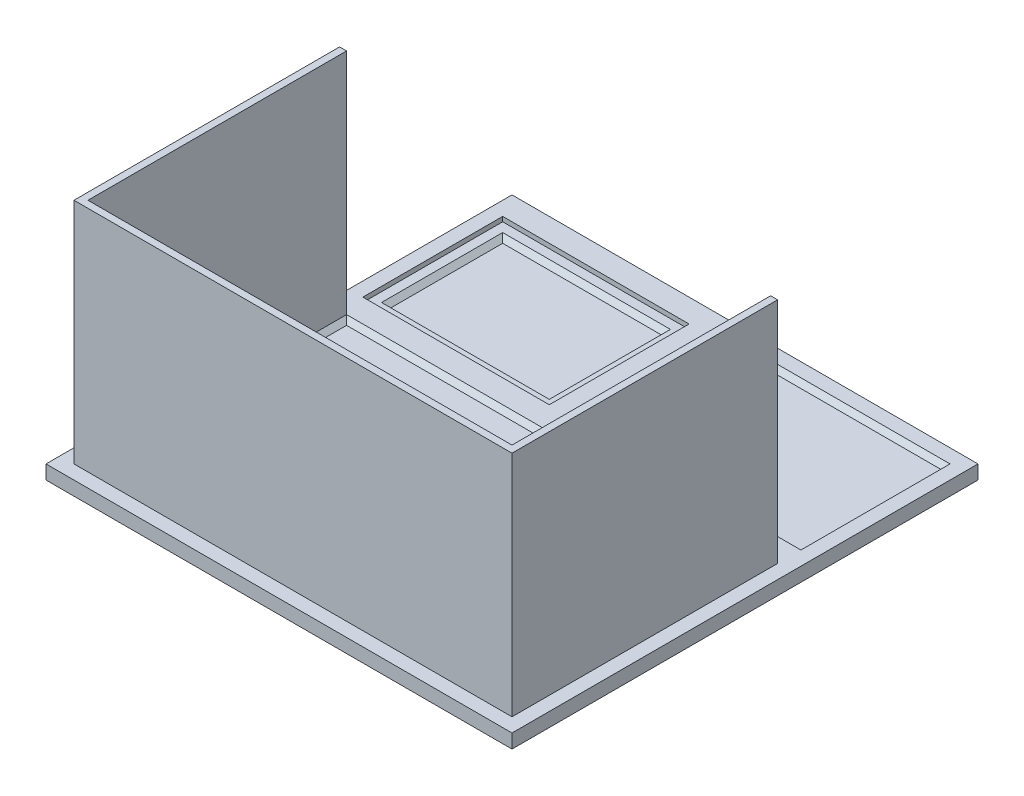
ISO-10303-21;
HEADER;
FILE_DESCRIPTION(('STEP AP214'),'2;1');
FILE_NAME('part.step','',(''),(''),'','','');
FILE_SCHEMA(('AUTOMOTIVE_DESIGN { 1 0 10303 214 1 1 1 1 }'));
ENDSEC;
DATA;
#1=APPLICATION_CONTEXT('core data for automotive mechanical design processes');
#2=APPLICATION_PROTOCOL_DEFINITION('international standard','automotive_design',2000,#1);
#3=PRODUCT_CONTEXT('',#1,'mechanical');
#4=PRODUCT('Part','Part','',(#3));
#5=PRODUCT_RELATED_PRODUCT_CATEGORY('part','',(#4));
#6=PRODUCT_DEFINITION_FORMATION('','',#4);
#7=PRODUCT_DEFINITION_CONTEXT('part definition',#1,'design');
#8=PRODUCT_DEFINITION('design','',#6,#7);
#9=PRODUCT_DEFINITION_SHAPE('','',#8);
#10=(LENGTH_UNIT() NAMED_UNIT(*) SI_UNIT(.MILLI.,.METRE.));
#11=(NAMED_UNIT(*) PLANE_ANGLE_UNIT() SI_UNIT($,.RADIAN.));
#12=(NAMED_UNIT(*) SI_UNIT($,.STERADIAN.) SOLID_ANGLE_UNIT());
#13=UNCERTAINTY_MEASURE_WITH_UNIT(LENGTH_MEASURE(1.E-05),#10,'distance_accuracy_value','');
#14=(GEOMETRIC_REPRESENTATION_CONTEXT(3) GLOBAL_UNCERTAINTY_ASSIGNED_CONTEXT((#13)) GLOBAL_UNIT_ASSIGNED_CONTEXT((#10,
#11,#12)) REPRESENTATION_CONTEXT('',''));
#15=CARTESIAN_POINT('',(0.,0.,0.));
#16=DIRECTION('',(0.,0.,1.));
#17=DIRECTION('',(1.,0.,0.));
#18=AXIS2_PLACEMENT_3D('',#15,#16,#17);
#19=CARTESIAN_POINT('',(0.,20.,0.));
#20=DIRECTION('',(0.,1.,0.));
#21=DIRECTION('',(0.,0.,1.));
#22=AXIS2_PLACEMENT_3D('',#19,#20,#21);
#23=PLANE('',#22);
#24=DIRECTION('',(-1.,0.,0.));
#25=VECTOR('',#24,1.);
#26=CARTESIAN_POINT('',(0.,20.,410.));
#27=LINE('',#26,#25);
#28=CARTESIAN_POINT('',(945.,20.,410.));
#29=VERTEX_POINT('',#28);
#30=CARTESIAN_POINT('',(55.,20.,410.));
#31=VERTEX_POINT('',#30);
#32=EDGE_CURVE('E64',#29,#31,#27,.T.);
#33=ORIENTED_EDGE('',*,*,#32,.T.);
#34=DIRECTION('',(0.,0.,1.));
#35=VECTOR('',#34,1.);
#36=CARTESIAN_POINT('',(55.,20.,0.));
#37=LINE('',#36,#35);
#38=CARTESIAN_POINT('',(55.,20.,945.));
#39=VERTEX_POINT('',#38);
#40=EDGE_CURVE('E431',#31,#39,#37,.T.);
#41=ORIENTED_EDGE('',*,*,#40,.T.);
#42=DIRECTION('',(1.,0.,0.));
#43=VECTOR('',#42,1.);
#44=CARTESIAN_POINT('',(1.15292391018766E-13,20.,945.));
#45=LINE('',#44,#43);
#46=CARTESIAN_POINT('',(945.,20.,945.));
#47=VERTEX_POINT('',#46);
#48=EDGE_CURVE('E423',#39,#47,#45,.T.);
#49=ORIENTED_EDGE('',*,*,#48,.T.);
#50=DIRECTION('',(0.,0.,-1.));
#51=VECTOR('',#50,1.);
#52=CARTESIAN_POINT('',(945.,20.,-1.89037974463202E-13));
#53=LINE('',#52,#51);
#54=EDGE_CURVE('E426',#47,#29,#53,.T.);
#55=ORIENTED_EDGE('',*,*,#54,.T.);
#56=EDGE_LOOP('',(#33,#41,#49,#55));
#57=FACE_BOUND('',#56,.T.);
#58=ADVANCED_FACE('F39',(#57),#23,.T.);
#59=CARTESIAN_POINT('',(0.,30.,0.));
#60=DIRECTION('',(1.,0.,0.));
#61=DIRECTION('',(0.,0.,-1.));
#62=AXIS2_PLACEMENT_3D('',#59,#60,#61);
#63=PLANE('',#62);
#64=DIRECTION('',(0.,0.,1.));
#65=VECTOR('',#64,1.);
#66=CARTESIAN_POINT('',(0.,0.,0.));
#67=LINE('',#66,#65);
#68=CARTESIAN_POINT('',(0.,0.,0.));
#69=VERTEX_POINT('',#68);
#70=CARTESIAN_POINT('',(0.,0.,1000.));
#71=VERTEX_POINT('',#70);
#72=EDGE_CURVE('E331',#69,#71,#67,.T.);
#73=ORIENTED_EDGE('',*,*,#72,.T.);
#74=DIRECTION('',(0.,-1.,0.));
#75=VECTOR('',#74,1.);
#76=CARTESIAN_POINT('',(0.,30.,1000.));
#77=LINE('',#76,#75);
#78=CARTESIAN_POINT('',(0.,30.,1000.));
#79=VERTEX_POINT('',#78);
#80=EDGE_CURVE('E377',#79,#71,#77,.T.);
#81=ORIENTED_EDGE('',*,*,#80,.F.);
#82=DIRECTION('',(0.,0.,1.));
#83=VECTOR('',#82,1.);
#84=CARTESIAN_POINT('',(0.,30.,0.));
#85=LINE('',#84,#83);
#86=CARTESIAN_POINT('',(0.,30.,0.));
#87=VERTEX_POINT('',#86);
#88=EDGE_CURVE('E340',#87,#79,#85,.T.);
#89=ORIENTED_EDGE('',*,*,#88,.F.);
#90=DIRECTION('',(0.,-1.,0.));
#91=VECTOR('',#90,1.);
#92=CARTESIAN_POINT('',(0.,30.,0.));
#93=LINE('',#92,#91);
#94=EDGE_CURVE('E354',#87,#69,#93,.T.);
#95=ORIENTED_EDGE('',*,*,#94,.T.);
#96=EDGE_LOOP('',(#73,#81,#89,#95));
#97=FACE_BOUND('',#96,.T.);
#98=ADVANCED_FACE('F546',(#97),#63,.F.);
#99=CARTESIAN_POINT('',(0.,30.,1000.));
#100=DIRECTION('',(0.,0.,-1.));
#101=DIRECTION('',(-1.,0.,0.));
#102=AXIS2_PLACEMENT_3D('',#99,#100,#101);
#103=PLANE('',#102);
#104=DIRECTION('',(1.,0.,0.));
#105=VECTOR('',#104,1.);
#106=CARTESIAN_POINT('',(0.,0.,1000.));
#107=LINE('',#106,#105);
#108=CARTESIAN_POINT('',(1000.,0.,1000.));
#109=VERTEX_POINT('',#108);
#110=EDGE_CURVE('E358',#71,#109,#107,.T.);
#111=ORIENTED_EDGE('',*,*,#110,.T.);
#112=DIRECTION('',(0.,-1.,0.));
#113=VECTOR('',#112,1.);
#114=CARTESIAN_POINT('',(1000.,30.,1000.));
#115=LINE('',#114,#113);
#116=CARTESIAN_POINT('',(1000.,30.,1000.));
#117=VERTEX_POINT('',#116);
#118=EDGE_CURVE('E373',#117,#109,#115,.T.);
#119=ORIENTED_EDGE('',*,*,#118,.F.);
#120=DIRECTION('',(1.,0.,0.));
#121=VECTOR('',#120,1.);
#122=CARTESIAN_POINT('',(0.,30.,1000.));
#123=LINE('',#122,#121);
#124=EDGE_CURVE('E344',#79,#117,#123,.T.);
#125=ORIENTED_EDGE('',*,*,#124,.F.);
#126=ORIENTED_EDGE('',*,*,#80,.T.);
#127=EDGE_LOOP('',(#111,#119,#125,#126));
#128=FACE_BOUND('',#127,.T.);
#129=ADVANCED_FACE('F551',(#128),#103,.F.);
#130=CARTESIAN_POINT('',(1000.,30.,0.));
#131=DIRECTION('',(-1.,0.,0.));
#132=DIRECTION('',(0.,0.,1.));
#133=AXIS2_PLACEMENT_3D('',#130,#131,#132);
#134=PLANE('',#133);
#135=DIRECTION('',(0.,0.,-1.));
#136=VECTOR('',#135,1.);
#137=CARTESIAN_POINT('',(1000.,0.,0.));
#138=LINE('',#137,#136);
#139=CARTESIAN_POINT('',(1000.,0.,0.));
#140=VERTEX_POINT('',#139);
#141=EDGE_CURVE('E361',#109,#140,#138,.T.);
#142=ORIENTED_EDGE('',*,*,#141,.T.);
#143=DIRECTION('',(0.,-1.,0.));
#144=VECTOR('',#143,1.);
#145=CARTESIAN_POINT('',(1000.,30.,0.));
#146=LINE('',#145,#144);
#147=CARTESIAN_POINT('',(1000.,30.,0.));
#148=VERTEX_POINT('',#147);
#149=EDGE_CURVE('E369',#148,#140,#146,.T.);
#150=ORIENTED_EDGE('',*,*,#149,.F.);
#151=DIRECTION('',(0.,0.,-1.));
#152=VECTOR('',#151,1.);
#153=CARTESIAN_POINT('',(1000.,30.,0.));
#154=LINE('',#153,#152);
#155=EDGE_CURVE('E348',#117,#148,#154,.T.);
#156=ORIENTED_EDGE('',*,*,#155,.F.);
#157=ORIENTED_EDGE('',*,*,#118,.T.);
#158=EDGE_LOOP('',(#142,#150,#156,#157));
#159=FACE_BOUND('',#158,.T.);
#160=ADVANCED_FACE('F593',(#159),#134,.F.);
#161=CARTESIAN_POINT('',(0.,30.,0.));
#162=DIRECTION('',(0.,0.,1.));
#163=DIRECTION('',(1.,0.,0.));
#164=AXIS2_PLACEMENT_3D('',#161,#162,#163);
#165=PLANE('',#164);
#166=DIRECTION('',(-1.,0.,0.));
#167=VECTOR('',#166,1.);
#168=CARTESIAN_POINT('',(0.,0.,0.));
#169=LINE('',#168,#167);
#170=EDGE_CURVE('E345',#140,#69,#169,.T.);
#171=ORIENTED_EDGE('',*,*,#170,.T.);
#172=ORIENTED_EDGE('',*,*,#94,.F.);
#173=DIRECTION('',(-1.,0.,0.));
#174=VECTOR('',#173,1.);
#175=CARTESIAN_POINT('',(0.,30.,0.));
#176=LINE('',#175,#174);
#177=EDGE_CURVE('E351',#148,#87,#176,.T.);
#178=ORIENTED_EDGE('',*,*,#177,.F.);
#179=ORIENTED_EDGE('',*,*,#149,.T.);
#180=EDGE_LOOP('',(#171,#172,#178,#179));
#181=FACE_BOUND('',#180,.T.);
#182=ADVANCED_FACE('F586',(#181),#165,.F.);
#183=CARTESIAN_POINT('',(0.,30.,0.));
#184=DIRECTION('',(0.,1.,0.));
#185=DIRECTION('',(0.,0.,1.));
#186=AXIS2_PLACEMENT_3D('',#183,#184,#185);
#187=PLANE('',#186);
#188=DIRECTION('',(0.,0.,1.));
#189=VECTOR('',#188,1.);
#190=CARTESIAN_POINT('',(480.,30.,30.));
#191=LINE('',#190,#189);
#192=CARTESIAN_POINT('',(480.,30.,30.));
#193=VERTEX_POINT('',#192);
#194=CARTESIAN_POINT('',(480.,30.,350.));
#195=VERTEX_POINT('',#194);
#196=EDGE_CURVE('E254',#193,#195,#191,.T.);
#197=ORIENTED_EDGE('',*,*,#196,.F.);
#198=DIRECTION('',(-1.,0.,0.));
#199=VECTOR('',#198,1.);
#200=CARTESIAN_POINT('',(480.,30.,30.));
#201=LINE('',#200,#199);
#202=CARTESIAN_POINT('',(970.,30.,30.));
#203=VERTEX_POINT('',#202);
#204=EDGE_CURVE('E267',#203,#193,#201,.T.);
#205=ORIENTED_EDGE('',*,*,#204,.F.);
#206=DIRECTION('',(0.,0.,-1.));
#207=VECTOR('',#206,1.);
#208=CARTESIAN_POINT('',(970.,30.,30.));
#209=LINE('',#208,#207);
#210=CARTESIAN_POINT('',(970.,30.,350.));
#211=VERTEX_POINT('',#210);
#212=EDGE_CURVE('E263',#211,#203,#209,.T.);
#213=ORIENTED_EDGE('',*,*,#212,.F.);
#214=DIRECTION('',(1.,0.,0.));
#215=VECTOR('',#214,1.);
#216=CARTESIAN_POINT('',(480.,30.,350.));
#217=LINE('',#216,#215);
#218=EDGE_CURVE('E258',#195,#211,#217,.T.);
#219=ORIENTED_EDGE('',*,*,#218,.F.);
#220=EDGE_LOOP('',(#197,#205,#213,#219));
#221=FACE_BOUND('',#220,.T.);
#222=DIRECTION('',(0.,0.,1.));
#223=VECTOR('',#222,1.);
#224=CARTESIAN_POINT('',(30.,30.,400.));
#225=LINE('',#224,#223);
#226=CARTESIAN_POINT('',(30.,30.,400.));
#227=VERTEX_POINT('',#226);
#228=CARTESIAN_POINT('',(30.0000000000001,30.,970.));
#229=VERTEX_POINT('',#228);
#230=EDGE_CURVE('E248',#227,#229,#225,.T.);
#231=ORIENTED_EDGE('',*,*,#230,.F.);
#232=DIRECTION('',(1.,0.,0.));
#233=VECTOR('',#232,1.);
#234=CARTESIAN_POINT('',(-1.48029736616688E-12,30.,400.));
#235=LINE('',#234,#233);
#236=CARTESIAN_POINT('',(45.,30.,400.));
#237=VERTEX_POINT('',#236);
#238=EDGE_CURVE('E243',#227,#237,#235,.T.);
#239=ORIENTED_EDGE('',*,*,#238,.T.);
#240=DIRECTION('',(-1.,0.,0.));
#241=VECTOR('',#240,1.);
#242=CARTESIAN_POINT('',(30.,30.,400.));
#243=LINE('',#242,#241);
#244=CARTESIAN_POINT('',(955.,30.,400.));
#245=VERTEX_POINT('',#244);
#246=EDGE_CURVE('E279',#245,#237,#243,.T.);
#247=ORIENTED_EDGE('',*,*,#246,.F.);
#248=CARTESIAN_POINT('',(970.,30.,400.));
#249=VERTEX_POINT('',#248);
#250=EDGE_CURVE('E259',#249,#245,#243,.T.);
#251=ORIENTED_EDGE('',*,*,#250,.F.);
#252=DIRECTION('',(0.,0.,-1.));
#253=VECTOR('',#252,1.);
#254=CARTESIAN_POINT('',(970.,30.,400.));
#255=LINE('',#254,#253);
#256=CARTESIAN_POINT('',(970.,30.,970.));
#257=VERTEX_POINT('',#256);
#258=EDGE_CURVE('E241',#257,#249,#255,.T.);
#259=ORIENTED_EDGE('',*,*,#258,.F.);
#260=DIRECTION('',(1.,0.,0.));
#261=VECTOR('',#260,1.);
#262=CARTESIAN_POINT('',(30.0000000000001,30.,970.));
#263=LINE('',#262,#261);
#264=EDGE_CURVE('E274',#229,#257,#263,.T.);
#265=ORIENTED_EDGE('',*,*,#264,.F.);
#266=EDGE_LOOP('',(#231,#239,#247,#251,#259,#265));
#267=FACE_BOUND('',#266,.T.);
#268=DIRECTION('',(0.,0.,1.));
#269=VECTOR('',#268,1.);
#270=CARTESIAN_POINT('',(30.,30.,50.));
#271=LINE('',#270,#269);
#272=CARTESIAN_POINT('',(30.,30.,50.));
#273=VERTEX_POINT('',#272);
#274=CARTESIAN_POINT('',(30.,30.,350.));
#275=VERTEX_POINT('',#274);
#276=EDGE_CURVE('E311',#273,#275,#271,.T.);
#277=ORIENTED_EDGE('',*,*,#276,.F.);
#278=DIRECTION('',(-1.,0.,0.));
#279=VECTOR('',#278,1.);
#280=CARTESIAN_POINT('',(30.,30.,50.));
#281=LINE('',#280,#279);
#282=CARTESIAN_POINT('',(430.,30.,50.));
#283=VERTEX_POINT('',#282);
#284=EDGE_CURVE('E323',#283,#273,#281,.T.);
#285=ORIENTED_EDGE('',*,*,#284,.F.);
#286=DIRECTION('',(0.,0.,-1.));
#287=VECTOR('',#286,1.);
#288=CARTESIAN_POINT('',(430.,30.,50.));
#289=LINE('',#288,#287);
#290=CARTESIAN_POINT('',(430.,30.,350.));
#291=VERTEX_POINT('',#290);
#292=EDGE_CURVE('E319',#291,#283,#289,.T.);
#293=ORIENTED_EDGE('',*,*,#292,.F.);
#294=DIRECTION('',(1.,0.,0.));
#295=VECTOR('',#294,1.);
#296=CARTESIAN_POINT('',(30.,30.,350.));
#297=LINE('',#296,#295);
#298=EDGE_CURVE('E315',#275,#291,#297,.T.);
#299=ORIENTED_EDGE('',*,*,#298,.F.);
#300=EDGE_LOOP('',(#277,#285,#293,#299));
#301=FACE_BOUND('',#300,.T.);
#302=ORIENTED_EDGE('',*,*,#88,.T.);
#303=ORIENTED_EDGE('',*,*,#124,.T.);
#304=ORIENTED_EDGE('',*,*,#155,.T.);
#305=ORIENTED_EDGE('',*,*,#177,.T.);
#306=EDGE_LOOP('',(#302,#303,#304,#305));
#307=FACE_BOUND('',#306,.T.);
#308=ADVANCED_FACE('F497',(#221,#267,#301,#307),#187,.T.);
#309=CARTESIAN_POINT('',(0.,0.,0.));
#310=DIRECTION('',(0.,1.,0.));
#311=DIRECTION('',(0.,0.,1.));
#312=AXIS2_PLACEMENT_3D('',#309,#310,#311);
#313=PLANE('',#312);
#314=ORIENTED_EDGE('',*,*,#72,.F.);
#315=ORIENTED_EDGE('',*,*,#170,.F.);
#316=ORIENTED_EDGE('',*,*,#141,.F.);
#317=ORIENTED_EDGE('',*,*,#110,.F.);
#318=EDGE_LOOP('',(#314,#315,#316,#317));
#319=FACE_BOUND('',#318,.T.);
#320=ADVANCED_FACE('F582',(#319),#313,.F.);
#321=CARTESIAN_POINT('',(30.,10.,50.));
#322=DIRECTION('',(-1.,0.,0.));
#323=DIRECTION('',(0.,0.,1.));
#324=AXIS2_PLACEMENT_3D('',#321,#322,#323);
#325=PLANE('',#324);
#326=DIRECTION('',(0.,1.,0.));
#327=VECTOR('',#326,1.);
#328=CARTESIAN_POINT('',(30.,10.,350.));
#329=LINE('',#328,#327);
#330=CARTESIAN_POINT('',(30.,20.,350.));
#331=VERTEX_POINT('',#330);
#332=EDGE_CURVE('E327',#331,#275,#329,.T.);
#333=ORIENTED_EDGE('',*,*,#332,.F.);
#334=DIRECTION('',(0.,0.,1.));
#335=VECTOR('',#334,1.);
#336=CARTESIAN_POINT('',(30.,20.,50.));
#337=LINE('',#336,#335);
#338=CARTESIAN_POINT('',(30.,20.,50.));
#339=VERTEX_POINT('',#338);
#340=EDGE_CURVE('E299',#339,#331,#337,.T.);
#341=ORIENTED_EDGE('',*,*,#340,.F.);
#342=DIRECTION('',(0.,1.,0.));
#343=VECTOR('',#342,1.);
#344=CARTESIAN_POINT('',(30.,10.,50.));
#345=LINE('',#344,#343);
#346=EDGE_CURVE('E328',#339,#273,#345,.T.);
#347=ORIENTED_EDGE('',*,*,#346,.T.);
#348=ORIENTED_EDGE('',*,*,#276,.T.);
#349=EDGE_LOOP('',(#333,#341,#347,#348));
#350=FACE_BOUND('',#349,.T.);
#351=ADVANCED_FACE('F572',(#350),#325,.F.);
#352=CARTESIAN_POINT('',(30.,10.,50.));
#353=DIRECTION('',(0.,0.,-1.));
#354=DIRECTION('',(-1.,0.,0.));
#355=AXIS2_PLACEMENT_3D('',#352,#353,#354);
#356=PLANE('',#355);
#357=ORIENTED_EDGE('',*,*,#346,.F.);
#358=DIRECTION('',(-1.,0.,0.));
#359=VECTOR('',#358,1.);
#360=CARTESIAN_POINT('',(30.,20.,50.));
#361=LINE('',#360,#359);
#362=CARTESIAN_POINT('',(430.,20.,50.));
#363=VERTEX_POINT('',#362);
#364=EDGE_CURVE('E308',#363,#339,#361,.T.);
#365=ORIENTED_EDGE('',*,*,#364,.F.);
#366=DIRECTION('',(0.,1.,0.));
#367=VECTOR('',#366,1.);
#368=CARTESIAN_POINT('',(430.,10.,50.));
#369=LINE('',#368,#367);
#370=EDGE_CURVE('E332',#363,#283,#369,.T.);
#371=ORIENTED_EDGE('',*,*,#370,.T.);
#372=ORIENTED_EDGE('',*,*,#284,.T.);
#373=EDGE_LOOP('',(#357,#365,#371,#372));
#374=FACE_BOUND('',#373,.T.);
#375=ADVANCED_FACE('F568',(#374),#356,.F.);
#376=CARTESIAN_POINT('',(430.,10.,50.));
#377=DIRECTION('',(1.,0.,0.));
#378=DIRECTION('',(0.,0.,-1.));
#379=AXIS2_PLACEMENT_3D('',#376,#377,#378);
#380=PLANE('',#379);
#381=ORIENTED_EDGE('',*,*,#370,.F.);
#382=DIRECTION('',(0.,0.,-1.));
#383=VECTOR('',#382,1.);
#384=CARTESIAN_POINT('',(430.,20.,50.));
#385=LINE('',#384,#383);
#386=CARTESIAN_POINT('',(430.,20.,350.));
#387=VERTEX_POINT('',#386);
#388=EDGE_CURVE('E305',#387,#363,#385,.T.);
#389=ORIENTED_EDGE('',*,*,#388,.F.);
#390=DIRECTION('',(0.,1.,0.));
#391=VECTOR('',#390,1.);
#392=CARTESIAN_POINT('',(430.,10.,350.));
#393=LINE('',#392,#391);
#394=EDGE_CURVE('E335',#387,#291,#393,.T.);
#395=ORIENTED_EDGE('',*,*,#394,.T.);
#396=ORIENTED_EDGE('',*,*,#292,.T.);
#397=EDGE_LOOP('',(#381,#389,#395,#396));
#398=FACE_BOUND('',#397,.T.);
#399=ADVANCED_FACE('F571',(#398),#380,.F.);
#400=CARTESIAN_POINT('',(30.,10.,350.));
#401=DIRECTION('',(0.,0.,1.));
#402=DIRECTION('',(1.,0.,0.));
#403=AXIS2_PLACEMENT_3D('',#400,#401,#402);
#404=PLANE('',#403);
#405=ORIENTED_EDGE('',*,*,#394,.F.);
#406=DIRECTION('',(1.,0.,0.));
#407=VECTOR('',#406,1.);
#408=CARTESIAN_POINT('',(30.,20.,350.));
#409=LINE('',#408,#407);
#410=EDGE_CURVE('E302',#331,#387,#409,.T.);
#411=ORIENTED_EDGE('',*,*,#410,.F.);
#412=ORIENTED_EDGE('',*,*,#332,.T.);
#413=ORIENTED_EDGE('',*,*,#298,.T.);
#414=EDGE_LOOP('',(#405,#411,#412,#413));
#415=FACE_BOUND('',#414,.T.);
#416=ADVANCED_FACE('F562',(#415),#404,.F.);
#417=CARTESIAN_POINT('',(0.,20.,0.));
#418=DIRECTION('',(0.,1.,0.));
#419=DIRECTION('',(0.,0.,1.));
#420=AXIS2_PLACEMENT_3D('',#417,#418,#419);
#421=PLANE('',#420);
#422=ORIENTED_EDGE('',*,*,#340,.T.);
#423=ORIENTED_EDGE('',*,*,#410,.T.);
#424=ORIENTED_EDGE('',*,*,#388,.T.);
#425=ORIENTED_EDGE('',*,*,#364,.T.);
#426=EDGE_LOOP('',(#422,#423,#424,#425));
#427=FACE_BOUND('',#426,.T.);
#428=DIRECTION('',(1.,0.,0.));
#429=VECTOR('',#428,1.);
#430=CARTESIAN_POINT('',(50.,20.,330.));
#431=LINE('',#430,#429);
#432=CARTESIAN_POINT('',(50.,20.,330.));
#433=VERTEX_POINT('',#432);
#434=CARTESIAN_POINT('',(410.,20.,330.));
#435=VERTEX_POINT('',#434);
#436=EDGE_CURVE('E286',#433,#435,#431,.T.);
#437=ORIENTED_EDGE('',*,*,#436,.F.);
#438=DIRECTION('',(0.,0.,1.));
#439=VECTOR('',#438,1.);
#440=CARTESIAN_POINT('',(50.,20.,70.));
#441=LINE('',#440,#439);
#442=CARTESIAN_POINT('',(50.,20.,70.));
#443=VERTEX_POINT('',#442);
#444=EDGE_CURVE('E282',#443,#433,#441,.T.);
#445=ORIENTED_EDGE('',*,*,#444,.F.);
#446=DIRECTION('',(-1.,0.,0.));
#447=VECTOR('',#446,1.);
#448=CARTESIAN_POINT('',(50.,20.,70.));
#449=LINE('',#448,#447);
#450=CARTESIAN_POINT('',(410.,20.,70.));
#451=VERTEX_POINT('',#450);
#452=EDGE_CURVE('E295',#451,#443,#449,.T.);
#453=ORIENTED_EDGE('',*,*,#452,.F.);
#454=DIRECTION('',(0.,0.,-1.));
#455=VECTOR('',#454,1.);
#456=CARTESIAN_POINT('',(410.,20.,70.));
#457=LINE('',#456,#455);
#458=EDGE_CURVE('E291',#435,#451,#457,.T.);
#459=ORIENTED_EDGE('',*,*,#458,.F.);
#460=EDGE_LOOP('',(#437,#445,#453,#459));
#461=FACE_BOUND('',#460,.T.);
#462=ADVANCED_FACE('F558',(#427,#461),#421,.T.);
#463=CARTESIAN_POINT('',(0.,10.,0.));
#464=DIRECTION('',(0.,1.,0.));
#465=DIRECTION('',(0.,0.,1.));
#466=AXIS2_PLACEMENT_3D('',#463,#464,#465);
#467=PLANE('',#466);
#468=DIRECTION('',(0.,0.,-1.));
#469=VECTOR('',#468,1.);
#470=CARTESIAN_POINT('',(400.,10.,70.));
#471=LINE('',#470,#469);
#472=CARTESIAN_POINT('',(400.,10.,320.));
#473=VERTEX_POINT('',#472);
#474=CARTESIAN_POINT('',(400.,10.,80.0000000000002));
#475=VERTEX_POINT('',#474);
#476=EDGE_CURVE('E387',#473,#475,#471,.T.);
#477=ORIENTED_EDGE('',*,*,#476,.T.);
#478=DIRECTION('',(-1.,0.,0.));
#479=VECTOR('',#478,1.);
#480=CARTESIAN_POINT('',(50.,10.,80.0000000000002));
#481=LINE('',#480,#479);
#482=CARTESIAN_POINT('',(60.0000000000002,10.,80.0000000000002));
#483=VERTEX_POINT('',#482);
#484=EDGE_CURVE('E390',#475,#483,#481,.T.);
#485=ORIENTED_EDGE('',*,*,#484,.T.);
#486=DIRECTION('',(0.,0.,1.));
#487=VECTOR('',#486,1.);
#488=CARTESIAN_POINT('',(60.0000000000003,10.,330.));
#489=LINE('',#488,#487);
#490=CARTESIAN_POINT('',(60.0000000000003,10.,320.));
#491=VERTEX_POINT('',#490);
#492=EDGE_CURVE('E381',#483,#491,#489,.T.);
#493=ORIENTED_EDGE('',*,*,#492,.T.);
#494=DIRECTION('',(1.,0.,0.));
#495=VECTOR('',#494,1.);
#496=CARTESIAN_POINT('',(410.,10.,320.));
#497=LINE('',#496,#495);
#498=EDGE_CURVE('E384',#491,#473,#497,.T.);
#499=ORIENTED_EDGE('',*,*,#498,.T.);
#500=EDGE_LOOP('',(#477,#485,#493,#499));
#501=FACE_BOUND('',#500,.T.);
#502=ADVANCED_FACE('F561',(#501),#467,.T.);
#503=CARTESIAN_POINT('',(0.,10.,320.));
#504=DIRECTION('',(0.,0.707106781186556,-0.707106781186539));
#505=DIRECTION('',(-1.,0.,0.));
#506=AXIS2_PLACEMENT_3D('',#503,#504,#505);
#507=PLANE('',#506);
#508=DIRECTION('',(0.577350269189631,-0.577350269189617,-0.57735026918963));
#509=VECTOR('',#508,1.);
#510=CARTESIAN_POINT('',(39.9999999999999,29.9999999999999,340.));
#511=LINE('',#510,#509);
#512=EDGE_CURVE('E400',#433,#491,#511,.T.);
#513=ORIENTED_EDGE('',*,*,#512,.F.);
#514=ORIENTED_EDGE('',*,*,#436,.T.);
#515=DIRECTION('',(-0.57735026918963,-0.577350269189617,-0.577350269189631));
#516=VECTOR('',#515,1.);
#517=CARTESIAN_POINT('',(293.333333333332,-96.6666666666659,213.333333333331));
#518=LINE('',#517,#516);
#519=EDGE_CURVE('E287',#473,#435,#518,.F.);
#520=ORIENTED_EDGE('',*,*,#519,.F.);
#521=ORIENTED_EDGE('',*,*,#498,.F.);
#522=EDGE_LOOP('',(#513,#514,#520,#521));
#523=FACE_BOUND('',#522,.T.);
#524=ADVANCED_FACE('F566',(#523),#507,.T.);
#525=CARTESIAN_POINT('',(400.,10.,0.));
#526=DIRECTION('',(-0.70710678118654,0.707106781186555,0.));
#527=DIRECTION('',(0.,0.,1.));
#528=AXIS2_PLACEMENT_3D('',#525,#526,#527);
#529=PLANE('',#528);
#530=ORIENTED_EDGE('',*,*,#519,.T.);
#531=ORIENTED_EDGE('',*,*,#458,.T.);
#532=DIRECTION('',(-0.57735026918963,-0.577350269189617,0.577350269189631));
#533=VECTOR('',#532,1.);
#534=CARTESIAN_POINT('',(266.666666666665,-123.333333333332,213.333333333335));
#535=LINE('',#534,#533);
#536=EDGE_CURVE('E397',#475,#451,#535,.F.);
#537=ORIENTED_EDGE('',*,*,#536,.F.);
#538=ORIENTED_EDGE('',*,*,#476,.F.);
#539=EDGE_LOOP('',(#530,#531,#537,#538));
#540=FACE_BOUND('',#539,.T.);
#541=ADVANCED_FACE('F608',(#540),#529,.T.);
#542=CARTESIAN_POINT('',(60.0000000000002,10.,0.));
#543=DIRECTION('',(0.707106781186539,0.707106781186556,0.));
#544=DIRECTION('',(0.,0.,-1.));
#545=AXIS2_PLACEMENT_3D('',#542,#543,#544);
#546=PLANE('',#545);
#547=ORIENTED_EDGE('',*,*,#512,.T.);
#548=ORIENTED_EDGE('',*,*,#492,.F.);
#549=DIRECTION('',(-0.577350269189631,0.577350269189617,-0.57735026918963));
#550=VECTOR('',#549,1.);
#551=CARTESIAN_POINT('',(39.9999999999998,29.9999999999999,59.9999999999998));
#552=LINE('',#551,#550);
#553=EDGE_CURVE('E271',#443,#483,#552,.F.);
#554=ORIENTED_EDGE('',*,*,#553,.F.);
#555=ORIENTED_EDGE('',*,*,#444,.T.);
#556=EDGE_LOOP('',(#547,#548,#554,#555));
#557=FACE_BOUND('',#556,.T.);
#558=ADVANCED_FACE('F604',(#557),#546,.T.);
#559=CARTESIAN_POINT('',(0.,10.,80.0000000000002));
#560=DIRECTION('',(0.,0.707106781186556,0.707106781186539));
#561=DIRECTION('',(1.,0.,0.));
#562=AXIS2_PLACEMENT_3D('',#559,#560,#561);
#563=PLANE('',#562);
#564=ORIENTED_EDGE('',*,*,#536,.T.);
#565=ORIENTED_EDGE('',*,*,#452,.T.);
#566=ORIENTED_EDGE('',*,*,#553,.T.);
#567=ORIENTED_EDGE('',*,*,#484,.F.);
#568=EDGE_LOOP('',(#564,#565,#566,#567));
#569=FACE_BOUND('',#568,.T.);
#570=ADVANCED_FACE('F601',(#569),#563,.T.);
#571=CARTESIAN_POINT('',(0.,20.,0.));
#572=DIRECTION('',(0.,1.,0.));
#573=DIRECTION('',(0.,0.,1.));
#574=AXIS2_PLACEMENT_3D('',#571,#572,#573);
#575=PLANE('',#574);
#576=DIRECTION('',(0.,0.,-1.));
#577=VECTOR('',#576,1.);
#578=CARTESIAN_POINT('',(960.,20.,0.));
#579=LINE('',#578,#577);
#580=CARTESIAN_POINT('',(960.,20.,340.));
#581=VERTEX_POINT('',#580);
#582=CARTESIAN_POINT('',(960.,20.,40.));
#583=VERTEX_POINT('',#582);
#584=EDGE_CURVE('E412',#581,#583,#579,.T.);
#585=ORIENTED_EDGE('',*,*,#584,.T.);
#586=DIRECTION('',(-1.,0.,0.));
#587=VECTOR('',#586,1.);
#588=CARTESIAN_POINT('',(0.,20.,40.));
#589=LINE('',#588,#587);
#590=CARTESIAN_POINT('',(490.,20.,40.));
#591=VERTEX_POINT('',#590);
#592=EDGE_CURVE('E415',#583,#591,#589,.T.);
#593=ORIENTED_EDGE('',*,*,#592,.T.);
#594=DIRECTION('',(0.,0.,1.));
#595=VECTOR('',#594,1.);
#596=CARTESIAN_POINT('',(490.,20.,0.));
#597=LINE('',#596,#595);
#598=CARTESIAN_POINT('',(490.,20.,340.));
#599=VERTEX_POINT('',#598);
#600=EDGE_CURVE('E394',#591,#599,#597,.T.);
#601=ORIENTED_EDGE('',*,*,#600,.T.);
#602=DIRECTION('',(1.,0.,0.));
#603=VECTOR('',#602,1.);
#604=CARTESIAN_POINT('',(0.,20.,340.));
#605=LINE('',#604,#603);
#606=EDGE_CURVE('E409',#599,#581,#605,.T.);
#607=ORIENTED_EDGE('',*,*,#606,.T.);
#608=EDGE_LOOP('',(#585,#593,#601,#607));
#609=FACE_BOUND('',#608,.T.);
#610=ADVANCED_FACE('F556',(#609),#575,.T.);
#611=CARTESIAN_POINT('',(970.,520.,970.));
#612=DIRECTION('',(-1.,0.,0.));
#613=DIRECTION('',(0.,0.,1.));
#614=AXIS2_PLACEMENT_3D('',#611,#612,#613);
#615=PLANE('',#614);
#616=ORIENTED_EDGE('',*,*,#258,.T.);
#617=DIRECTION('',(0.,-1.,0.));
#618=VECTOR('',#617,1.);
#619=CARTESIAN_POINT('',(970.,520.,400.));
#620=LINE('',#619,#618);
#621=CARTESIAN_POINT('',(970.,520.,400.));
#622=VERTEX_POINT('',#621);
#623=EDGE_CURVE('E220',#622,#249,#620,.T.);
#624=ORIENTED_EDGE('',*,*,#623,.F.);
#625=DIRECTION('',(0.,0.,-1.));
#626=VECTOR('',#625,1.);
#627=CARTESIAN_POINT('',(970.,520.,970.));
#628=LINE('',#627,#626);
#629=CARTESIAN_POINT('',(970.,520.,970.));
#630=VERTEX_POINT('',#629);
#631=EDGE_CURVE('E227',#630,#622,#628,.T.);
#632=ORIENTED_EDGE('',*,*,#631,.F.);
#633=DIRECTION('',(0.,-1.,0.));
#634=VECTOR('',#633,1.);
#635=CARTESIAN_POINT('',(970.,520.,970.));
#636=LINE('',#635,#634);
#637=EDGE_CURVE('E509',#630,#257,#636,.T.);
#638=ORIENTED_EDGE('',*,*,#637,.T.);
#639=EDGE_LOOP('',(#616,#624,#632,#638));
#640=FACE_BOUND('',#639,.T.);
#641=ADVANCED_FACE('F239',(#640),#615,.F.);
#642=CARTESIAN_POINT('',(970.,520.,400.));
#643=DIRECTION('',(0.,0.,1.));
#644=DIRECTION('',(1.,0.,0.));
#645=AXIS2_PLACEMENT_3D('',#642,#643,#644);
#646=PLANE('',#645);
#647=ORIENTED_EDGE('',*,*,#250,.T.);
#648=DIRECTION('',(0.,-1.,0.));
#649=VECTOR('',#648,1.);
#650=CARTESIAN_POINT('',(955.,520.,400.));
#651=LINE('',#650,#649);
#652=CARTESIAN_POINT('',(955.,520.,400.));
#653=VERTEX_POINT('',#652);
#654=EDGE_CURVE('E222',#653,#245,#651,.T.);
#655=ORIENTED_EDGE('',*,*,#654,.F.);
#656=DIRECTION('',(-1.,0.,0.));
#657=VECTOR('',#656,1.);
#658=CARTESIAN_POINT('',(970.,520.,400.));
#659=LINE('',#658,#657);
#660=EDGE_CURVE('E216',#622,#653,#659,.T.);
#661=ORIENTED_EDGE('',*,*,#660,.F.);
#662=ORIENTED_EDGE('',*,*,#623,.T.);
#663=EDGE_LOOP('',(#647,#655,#661,#662));
#664=FACE_BOUND('',#663,.T.);
#665=ADVANCED_FACE('F218',(#664),#646,.F.);
#666=CARTESIAN_POINT('',(955.,520.,400.));
#667=DIRECTION('',(1.,0.,0.));
#668=DIRECTION('',(0.,0.,-1.));
#669=AXIS2_PLACEMENT_3D('',#666,#667,#668);
#670=PLANE('',#669);
#671=ORIENTED_EDGE('',*,*,#654,.T.);
#672=DIRECTION('',(0.,0.,1.));
#673=VECTOR('',#672,1.);
#674=CARTESIAN_POINT('',(955.,30.,400.));
#675=LINE('',#674,#673);
#676=CARTESIAN_POINT('',(955.,30.,955.));
#677=VERTEX_POINT('',#676);
#678=EDGE_CURVE('E49',#245,#677,#675,.T.);
#679=ORIENTED_EDGE('',*,*,#678,.T.);
#680=DIRECTION('',(0.,-1.,0.));
#681=VECTOR('',#680,1.);
#682=CARTESIAN_POINT('',(955.,520.,955.));
#683=LINE('',#682,#681);
#684=CARTESIAN_POINT('',(955.,520.,955.));
#685=VERTEX_POINT('',#684);
#686=EDGE_CURVE('E250',#685,#677,#683,.T.);
#687=ORIENTED_EDGE('',*,*,#686,.F.);
#688=DIRECTION('',(0.,0.,1.));
#689=VECTOR('',#688,1.);
#690=CARTESIAN_POINT('',(955.,520.,400.));
#691=LINE('',#690,#689);
#692=EDGE_CURVE('E226',#653,#685,#691,.T.);
#693=ORIENTED_EDGE('',*,*,#692,.F.);
#694=EDGE_LOOP('',(#671,#679,#687,#693));
#695=FACE_BOUND('',#694,.T.);
#696=ADVANCED_FACE('F523',(#695),#670,.F.);
#697=CARTESIAN_POINT('',(955.,520.,955.));
#698=DIRECTION('',(0.,0.,1.));
#699=DIRECTION('',(1.,0.,0.));
#700=AXIS2_PLACEMENT_3D('',#697,#698,#699);
#701=PLANE('',#700);
#702=ORIENTED_EDGE('',*,*,#686,.T.);
#703=DIRECTION('',(-1.,0.,0.));
#704=VECTOR('',#703,1.);
#705=CARTESIAN_POINT('',(955.,30.,955.));
#706=LINE('',#705,#704);
#707=CARTESIAN_POINT('',(45.,30.,955.));
#708=VERTEX_POINT('',#707);
#709=EDGE_CURVE('E11',#677,#708,#706,.T.);
#710=ORIENTED_EDGE('',*,*,#709,.T.);
#711=DIRECTION('',(0.,-1.,0.));
#712=VECTOR('',#711,1.);
#713=CARTESIAN_POINT('',(45.,520.,955.));
#714=LINE('',#713,#712);
#715=CARTESIAN_POINT('',(45.,520.,955.));
#716=VERTEX_POINT('',#715);
#717=EDGE_CURVE('E487',#716,#708,#714,.T.);
#718=ORIENTED_EDGE('',*,*,#717,.F.);
#719=DIRECTION('',(-1.,0.,0.));
#720=VECTOR('',#719,1.);
#721=CARTESIAN_POINT('',(955.,520.,955.));
#722=LINE('',#721,#720);
#723=EDGE_CURVE('E522',#685,#716,#722,.T.);
#724=ORIENTED_EDGE('',*,*,#723,.F.);
#725=EDGE_LOOP('',(#702,#710,#718,#724));
#726=FACE_BOUND('',#725,.T.);
#727=ADVANCED_FACE('F521',(#726),#701,.F.);
#728=CARTESIAN_POINT('',(45.,520.,955.));
#729=DIRECTION('',(-1.,0.,0.));
#730=DIRECTION('',(0.,0.,1.));
#731=AXIS2_PLACEMENT_3D('',#728,#729,#730);
#732=PLANE('',#731);
#733=ORIENTED_EDGE('',*,*,#717,.T.);
#734=DIRECTION('',(0.,0.,-1.));
#735=VECTOR('',#734,1.);
#736=CARTESIAN_POINT('',(45.,30.,955.));
#737=LINE('',#736,#735);
#738=EDGE_CURVE('E419',#708,#237,#737,.T.);
#739=ORIENTED_EDGE('',*,*,#738,.T.);
#740=DIRECTION('',(0.,-1.,0.));
#741=VECTOR('',#740,1.);
#742=CARTESIAN_POINT('',(45.,520.,400.));
#743=LINE('',#742,#741);
#744=CARTESIAN_POINT('',(45.,520.,400.));
#745=VERTEX_POINT('',#744);
#746=EDGE_CURVE('E484',#745,#237,#743,.T.);
#747=ORIENTED_EDGE('',*,*,#746,.F.);
#748=DIRECTION('',(0.,0.,-1.));
#749=VECTOR('',#748,1.);
#750=CARTESIAN_POINT('',(45.,520.,955.));
#751=LINE('',#750,#749);
#752=EDGE_CURVE('E527',#716,#745,#751,.T.);
#753=ORIENTED_EDGE('',*,*,#752,.F.);
#754=EDGE_LOOP('',(#733,#739,#747,#753));
#755=FACE_BOUND('',#754,.T.);
#756=ADVANCED_FACE('F482',(#755),#732,.F.);
#757=CARTESIAN_POINT('',(45.,520.,400.));
#758=DIRECTION('',(0.,0.,1.));
#759=DIRECTION('',(1.,0.,0.));
#760=AXIS2_PLACEMENT_3D('',#757,#758,#759);
#761=PLANE('',#760);
#762=ORIENTED_EDGE('',*,*,#238,.F.);
#763=DIRECTION('',(0.,-1.,0.));
#764=VECTOR('',#763,1.);
#765=CARTESIAN_POINT('',(30.,520.,400.));
#766=LINE('',#765,#764);
#767=CARTESIAN_POINT('',(30.,520.,400.));
#768=VERTEX_POINT('',#767);
#769=EDGE_CURVE('E494',#768,#227,#766,.T.);
#770=ORIENTED_EDGE('',*,*,#769,.F.);
#771=DIRECTION('',(-1.,0.,0.));
#772=VECTOR('',#771,1.);
#773=CARTESIAN_POINT('',(45.,520.,400.));
#774=LINE('',#773,#772);
#775=EDGE_CURVE('E492',#745,#768,#774,.T.);
#776=ORIENTED_EDGE('',*,*,#775,.F.);
#777=ORIENTED_EDGE('',*,*,#746,.T.);
#778=EDGE_LOOP('',(#762,#770,#776,#777));
#779=FACE_BOUND('',#778,.T.);
#780=ADVANCED_FACE('F489',(#779),#761,.F.);
#781=CARTESIAN_POINT('',(30.,520.,400.));
#782=DIRECTION('',(1.,0.,0.));
#783=DIRECTION('',(0.,0.,-1.));
#784=AXIS2_PLACEMENT_3D('',#781,#782,#783);
#785=PLANE('',#784);
#786=ORIENTED_EDGE('',*,*,#230,.T.);
#787=DIRECTION('',(0.,-1.,0.));
#788=VECTOR('',#787,1.);
#789=CARTESIAN_POINT('',(30.0000000000001,520.,970.));
#790=LINE('',#789,#788);
#791=CARTESIAN_POINT('',(30.0000000000001,520.,970.));
#792=VERTEX_POINT('',#791);
#793=EDGE_CURVE('E505',#792,#229,#790,.T.);
#794=ORIENTED_EDGE('',*,*,#793,.F.);
#795=DIRECTION('',(0.,0.,1.));
#796=VECTOR('',#795,1.);
#797=CARTESIAN_POINT('',(30.,520.,400.));
#798=LINE('',#797,#796);
#799=EDGE_CURVE('E534',#768,#792,#798,.T.);
#800=ORIENTED_EDGE('',*,*,#799,.F.);
#801=ORIENTED_EDGE('',*,*,#769,.T.);
#802=EDGE_LOOP('',(#786,#794,#800,#801));
#803=FACE_BOUND('',#802,.T.);
#804=ADVANCED_FACE('F503',(#803),#785,.F.);
#805=CARTESIAN_POINT('',(30.0000000000001,520.,970.));
#806=DIRECTION('',(0.,0.,-1.));
#807=DIRECTION('',(-1.,0.,0.));
#808=AXIS2_PLACEMENT_3D('',#805,#806,#807);
#809=PLANE('',#808);
#810=ORIENTED_EDGE('',*,*,#264,.T.);
#811=ORIENTED_EDGE('',*,*,#637,.F.);
#812=DIRECTION('',(1.,0.,0.));
#813=VECTOR('',#812,1.);
#814=CARTESIAN_POINT('',(30.0000000000001,520.,970.));
#815=LINE('',#814,#813);
#816=EDGE_CURVE('E232',#792,#630,#815,.T.);
#817=ORIENTED_EDGE('',*,*,#816,.F.);
#818=ORIENTED_EDGE('',*,*,#793,.T.);
#819=EDGE_LOOP('',(#810,#811,#817,#818));
#820=FACE_BOUND('',#819,.T.);
#821=ADVANCED_FACE('F507',(#820),#809,.F.);
#822=CARTESIAN_POINT('',(0.,520.,0.));
#823=DIRECTION('',(0.,1.,0.));
#824=DIRECTION('',(0.,0.,1.));
#825=AXIS2_PLACEMENT_3D('',#822,#823,#824);
#826=PLANE('',#825);
#827=ORIENTED_EDGE('',*,*,#631,.T.);
#828=ORIENTED_EDGE('',*,*,#660,.T.);
#829=ORIENTED_EDGE('',*,*,#692,.T.);
#830=ORIENTED_EDGE('',*,*,#723,.T.);
#831=ORIENTED_EDGE('',*,*,#752,.T.);
#832=ORIENTED_EDGE('',*,*,#775,.T.);
#833=ORIENTED_EDGE('',*,*,#799,.T.);
#834=ORIENTED_EDGE('',*,*,#816,.T.);
#835=EDGE_LOOP('',(#827,#828,#829,#830,#831,#832,#833,#834));
#836=FACE_BOUND('',#835,.T.);
#837=ADVANCED_FACE('F230',(#836),#826,.T.);
#838=CARTESIAN_POINT('',(0.,20.,340.));
#839=DIRECTION('',(0.,-0.707106781186547,0.707106781186547));
#840=DIRECTION('',(1.,0.,0.));
#841=AXIS2_PLACEMENT_3D('',#838,#839,#840);
#842=PLANE('',#841);
#843=DIRECTION('',(0.577350269189626,-0.577350269189626,-0.577350269189626));
#844=VECTOR('',#843,1.);
#845=CARTESIAN_POINT('',(326.666666666667,183.333333333333,503.333333333333));
#846=LINE('',#845,#844);
#847=EDGE_CURVE('E442',#195,#599,#846,.T.);
#848=ORIENTED_EDGE('',*,*,#847,.F.);
#849=ORIENTED_EDGE('',*,*,#218,.T.);
#850=DIRECTION('',(-0.577350269189626,-0.577350269189626,-0.577350269189626));
#851=VECTOR('',#850,1.);
#852=CARTESIAN_POINT('',(846.666666666667,-93.3333333333333,226.666666666667));
#853=LINE('',#852,#851);
#854=EDGE_CURVE('E237',#581,#211,#853,.F.);
#855=ORIENTED_EDGE('',*,*,#854,.F.);
#856=ORIENTED_EDGE('',*,*,#606,.F.);
#857=EDGE_LOOP('',(#848,#849,#855,#856));
#858=FACE_BOUND('',#857,.T.);
#859=ADVANCED_FACE('F627',(#858),#842,.F.);
#860=CARTESIAN_POINT('',(960.,20.,0.));
#861=DIRECTION('',(0.707106781186547,-0.707106781186547,0.));
#862=DIRECTION('',(0.,0.,-1.));
#863=AXIS2_PLACEMENT_3D('',#860,#861,#862);
#864=PLANE('',#863);
#865=ORIENTED_EDGE('',*,*,#854,.T.);
#866=ORIENTED_EDGE('',*,*,#212,.T.);
#867=DIRECTION('',(-0.577350269189626,-0.577350269189626,0.577350269189626));
#868=VECTOR('',#867,1.);
#869=CARTESIAN_POINT('',(640.,-300.,360.));
#870=LINE('',#869,#868);
#871=EDGE_CURVE('E439',#583,#203,#870,.F.);
#872=ORIENTED_EDGE('',*,*,#871,.F.);
#873=ORIENTED_EDGE('',*,*,#584,.F.);
#874=EDGE_LOOP('',(#865,#866,#872,#873));
#875=FACE_BOUND('',#874,.T.);
#876=ADVANCED_FACE('F623',(#875),#864,.F.);
#877=CARTESIAN_POINT('',(490.,20.,0.));
#878=DIRECTION('',(-0.707106781186547,-0.707106781186548,0.));
#879=DIRECTION('',(0.,0.,1.));
#880=AXIS2_PLACEMENT_3D('',#877,#878,#879);
#881=PLANE('',#880);
#882=ORIENTED_EDGE('',*,*,#847,.T.);
#883=ORIENTED_EDGE('',*,*,#600,.F.);
#884=DIRECTION('',(-0.577350269189626,0.577350269189626,-0.577350269189626));
#885=VECTOR('',#884,1.);
#886=CARTESIAN_POINT('',(326.666666666667,183.333333333333,-123.333333333333));
#887=LINE('',#886,#885);
#888=EDGE_CURVE('E436',#193,#591,#887,.F.);
#889=ORIENTED_EDGE('',*,*,#888,.F.);
#890=ORIENTED_EDGE('',*,*,#196,.T.);
#891=EDGE_LOOP('',(#882,#883,#889,#890));
#892=FACE_BOUND('',#891,.T.);
#893=ADVANCED_FACE('F619',(#892),#881,.F.);
#894=CARTESIAN_POINT('',(0.,20.,40.));
#895=DIRECTION('',(0.,-0.707106781186547,-0.707106781186547));
#896=DIRECTION('',(-1.,0.,0.));
#897=AXIS2_PLACEMENT_3D('',#894,#895,#896);
#898=PLANE('',#897);
#899=ORIENTED_EDGE('',*,*,#871,.T.);
#900=ORIENTED_EDGE('',*,*,#204,.T.);
#901=ORIENTED_EDGE('',*,*,#888,.T.);
#902=ORIENTED_EDGE('',*,*,#592,.F.);
#903=EDGE_LOOP('',(#899,#900,#901,#902));
#904=FACE_BOUND('',#903,.T.);
#905=ADVANCED_FACE('F616',(#904),#898,.F.);
#906=CARTESIAN_POINT('',(955.,30.,400.));
#907=DIRECTION('',(0.707106781186551,-0.707106781186544,0.));
#908=DIRECTION('',(0.,0.,1.));
#909=AXIS2_PLACEMENT_3D('',#906,#907,#908);
#910=PLANE('',#909);
#911=DIRECTION('',(-0.577350269189622,-0.577350269189628,0.577350269189628));
#912=VECTOR('',#911,1.);
#913=CARTESIAN_POINT('',(630.000000000005,-294.999999999999,724.999999999999));
#914=LINE('',#913,#912);
#915=EDGE_CURVE('E454',#29,#245,#914,.F.);
#916=ORIENTED_EDGE('',*,*,#915,.F.);
#917=ORIENTED_EDGE('',*,*,#54,.F.);
#918=DIRECTION('',(-0.577350269189624,-0.57735026918963,-0.577350269189623));
#919=VECTOR('',#918,1.);
#920=CARTESIAN_POINT('',(770.000000000002,-155.,770.000000000002));
#921=LINE('',#920,#919);
#922=EDGE_CURVE('E43',#677,#47,#921,.T.);
#923=ORIENTED_EDGE('',*,*,#922,.F.);
#924=ORIENTED_EDGE('',*,*,#678,.F.);
#925=EDGE_LOOP('',(#916,#917,#923,#924));
#926=FACE_BOUND('',#925,.T.);
#927=ADVANCED_FACE('F41',(#926),#910,.F.);
#928=CARTESIAN_POINT('',(955.,30.,955.));
#929=DIRECTION('',(0.,-0.707106781186543,0.707106781186552));
#930=DIRECTION('',(-1.,0.,0.));
#931=AXIS2_PLACEMENT_3D('',#928,#929,#930);
#932=PLANE('',#931);
#933=ORIENTED_EDGE('',*,*,#922,.T.);
#934=ORIENTED_EDGE('',*,*,#48,.F.);
#935=DIRECTION('',(-0.577350269189627,0.577350269189629,0.577350269189621));
#936=VECTOR('',#935,1.);
#937=CARTESIAN_POINT('',(45.,30.,955.));
#938=LINE('',#937,#936);
#939=EDGE_CURVE('E452',#708,#39,#938,.F.);
#940=ORIENTED_EDGE('',*,*,#939,.F.);
#941=ORIENTED_EDGE('',*,*,#709,.F.);
#942=EDGE_LOOP('',(#933,#934,#940,#941));
#943=FACE_BOUND('',#942,.T.);
#944=ADVANCED_FACE('F466',(#943),#932,.F.);
#945=CARTESIAN_POINT('',(0.,20.,410.));
#946=DIRECTION('',(0.,-0.707106781186547,-0.707106781186547));
#947=DIRECTION('',(-1.,0.,0.));
#948=AXIS2_PLACEMENT_3D('',#945,#946,#947);
#949=PLANE('',#948);
#950=ORIENTED_EDGE('',*,*,#915,.T.);
#951=ORIENTED_EDGE('',*,*,#246,.T.);
#952=DIRECTION('',(0.577350269189625,-0.577350269189626,0.577350269189626));
#953=VECTOR('',#952,1.);
#954=CARTESIAN_POINT('',(230.,-155.,585.));
#955=LINE('',#954,#953);
#956=EDGE_CURVE('E449',#31,#237,#955,.F.);
#957=ORIENTED_EDGE('',*,*,#956,.F.);
#958=ORIENTED_EDGE('',*,*,#32,.F.);
#959=EDGE_LOOP('',(#950,#951,#957,#958));
#960=FACE_BOUND('',#959,.T.);
#961=ADVANCED_FACE('F474',(#960),#949,.F.);
#962=CARTESIAN_POINT('',(45.,30.,955.));
#963=DIRECTION('',(-0.707106781186548,-0.707106781186547,0.));
#964=DIRECTION('',(0.,0.,-1.));
#965=AXIS2_PLACEMENT_3D('',#962,#963,#964);
#966=PLANE('',#965);
#967=ORIENTED_EDGE('',*,*,#939,.T.);
#968=ORIENTED_EDGE('',*,*,#40,.F.);
#969=ORIENTED_EDGE('',*,*,#956,.T.);
#970=ORIENTED_EDGE('',*,*,#738,.F.);
#971=EDGE_LOOP('',(#967,#968,#969,#970));
#972=FACE_BOUND('',#971,.T.);
#973=ADVANCED_FACE('F472',(#972),#966,.F.);
#974=CLOSED_SHELL('',(#58,#98,#129,#160,#182,#308,#320,#351,#375,#399,#416,#462,#502,#524,#541,
#558,#570,#610,#641,#665,#696,#727,#756,#780,#804,#821,#837,#859,#876,#893,#905,#927,#944,#961,#973));
#975=MANIFOLD_SOLID_BREP('B2',#974);
#976=ADVANCED_BREP_SHAPE_REPRESENTATION('',(#18,#975),#14);
#977=SHAPE_DEFINITION_REPRESENTATION(#9,#976);
ENDSEC;
END-ISO-10303-21;
